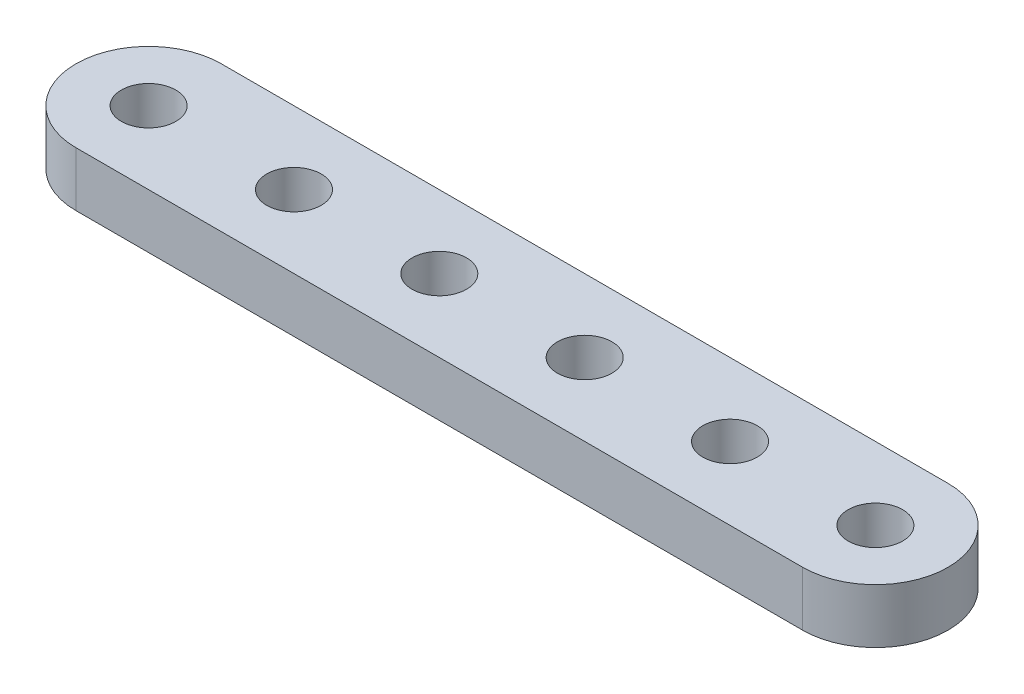
ISO-10303-21;
HEADER;
FILE_DESCRIPTION(('STEP AP214'),'2;1');
FILE_NAME('part.step','',(''),(''),'','','');
FILE_SCHEMA(('AUTOMOTIVE_DESIGN { 1 0 10303 214 1 1 1 1 }'));
ENDSEC;
DATA;
#1=APPLICATION_CONTEXT('core data for automotive mechanical design processes');
#2=APPLICATION_PROTOCOL_DEFINITION('international standard','automotive_design',2000,#1);
#3=PRODUCT_CONTEXT('',#1,'mechanical');
#4=PRODUCT('Part','Part','',(#3));
#5=PRODUCT_RELATED_PRODUCT_CATEGORY('part','',(#4));
#6=PRODUCT_DEFINITION_FORMATION('','',#4);
#7=PRODUCT_DEFINITION_CONTEXT('part definition',#1,'design');
#8=PRODUCT_DEFINITION('design','',#6,#7);
#9=PRODUCT_DEFINITION_SHAPE('','',#8);
#10=(LENGTH_UNIT() NAMED_UNIT(*) SI_UNIT(.MILLI.,.METRE.));
#11=(NAMED_UNIT(*) PLANE_ANGLE_UNIT() SI_UNIT($,.RADIAN.));
#12=(NAMED_UNIT(*) SI_UNIT($,.STERADIAN.) SOLID_ANGLE_UNIT());
#13=UNCERTAINTY_MEASURE_WITH_UNIT(LENGTH_MEASURE(1.E-05),#10,'distance_accuracy_value','');
#14=(GEOMETRIC_REPRESENTATION_CONTEXT(3) GLOBAL_UNCERTAINTY_ASSIGNED_CONTEXT((#13)) GLOBAL_UNIT_ASSIGNED_CONTEXT((#10,
#11,#12)) REPRESENTATION_CONTEXT('',''));
#15=CARTESIAN_POINT('',(0.,0.,0.));
#16=DIRECTION('',(0.,0.,1.));
#17=DIRECTION('',(1.,0.,0.));
#18=AXIS2_PLACEMENT_3D('',#15,#16,#17);
#19=CARTESIAN_POINT('',(0.,3.,0.));
#20=DIRECTION('',(0.,1.,0.));
#21=DIRECTION('',(0.,0.,1.));
#22=AXIS2_PLACEMENT_3D('',#19,#20,#21);
#23=PLANE('',#22);
#24=CARTESIAN_POINT('',(32.,3.,0.));
#25=DIRECTION('',(0.,1.,0.));
#26=DIRECTION('',(0.,0.,1.));
#27=AXIS2_PLACEMENT_3D('',#24,#25,#26);
#28=CIRCLE('',#27,1.5);
#29=CARTESIAN_POINT('',(32.,3.,1.5));
#30=VERTEX_POINT('',#29);
#31=EDGE_CURVE('E135',#30,#30,#28,.T.);
#32=ORIENTED_EDGE('',*,*,#31,.F.);
#33=EDGE_LOOP('',(#32));
#34=FACE_BOUND('',#33,.T.);
#35=CARTESIAN_POINT('',(16.,3.,0.));
#36=DIRECTION('',(0.,1.,0.));
#37=DIRECTION('',(0.,0.,1.));
#38=AXIS2_PLACEMENT_3D('',#35,#36,#37);
#39=CIRCLE('',#38,1.5);
#40=CARTESIAN_POINT('',(16.,3.,1.5));
#41=VERTEX_POINT('',#40);
#42=EDGE_CURVE('E123',#41,#41,#39,.T.);
#43=ORIENTED_EDGE('',*,*,#42,.F.);
#44=EDGE_LOOP('',(#43));
#45=FACE_BOUND('',#44,.T.);
#46=CARTESIAN_POINT('',(0.,3.,0.));
#47=DIRECTION('',(0.,1.,0.));
#48=DIRECTION('',(0.,0.,1.));
#49=AXIS2_PLACEMENT_3D('',#46,#47,#48);
#50=CIRCLE('',#49,1.5);
#51=CARTESIAN_POINT('',(0.,3.,1.5));
#52=VERTEX_POINT('',#51);
#53=EDGE_CURVE('E102',#52,#52,#50,.T.);
#54=ORIENTED_EDGE('',*,*,#53,.F.);
#55=EDGE_LOOP('',(#54));
#56=FACE_BOUND('',#55,.T.);
#57=CARTESIAN_POINT('',(0.,3.,0.));
#58=DIRECTION('',(0.,1.,0.));
#59=DIRECTION('',(0.,0.,1.));
#60=AXIS2_PLACEMENT_3D('',#57,#58,#59);
#61=CIRCLE('',#60,4.);
#62=CARTESIAN_POINT('',(0.,3.,-4.));
#63=VERTEX_POINT('',#62);
#64=CARTESIAN_POINT('',(0.,3.,4.));
#65=VERTEX_POINT('',#64);
#66=EDGE_CURVE('E87',#63,#65,#61,.T.);
#67=ORIENTED_EDGE('',*,*,#66,.T.);
#68=DIRECTION('',(1.,0.,0.));
#69=VECTOR('',#68,1.);
#70=CARTESIAN_POINT('',(0.,3.,4.));
#71=LINE('',#70,#69);
#72=CARTESIAN_POINT('',(40.,3.,4.));
#73=VERTEX_POINT('',#72);
#74=EDGE_CURVE('E82',#65,#73,#71,.T.);
#75=ORIENTED_EDGE('',*,*,#74,.T.);
#76=CARTESIAN_POINT('',(40.,3.,0.));
#77=DIRECTION('',(0.,1.,0.));
#78=DIRECTION('',(0.,0.,1.));
#79=AXIS2_PLACEMENT_3D('',#76,#77,#78);
#80=CIRCLE('',#79,4.);
#81=CARTESIAN_POINT('',(40.,3.,-4.));
#82=VERTEX_POINT('',#81);
#83=EDGE_CURVE('E85',#73,#82,#80,.T.);
#84=ORIENTED_EDGE('',*,*,#83,.T.);
#85=DIRECTION('',(-1.,0.,0.));
#86=VECTOR('',#85,1.);
#87=CARTESIAN_POINT('',(0.,3.,-4.));
#88=LINE('',#87,#86);
#89=EDGE_CURVE('E52',#82,#63,#88,.T.);
#90=ORIENTED_EDGE('',*,*,#89,.T.);
#91=EDGE_LOOP('',(#67,#75,#84,#90));
#92=FACE_BOUND('',#91,.T.);
#93=CARTESIAN_POINT('',(8.,3.,0.));
#94=DIRECTION('',(0.,1.,0.));
#95=DIRECTION('',(0.,0.,1.));
#96=AXIS2_PLACEMENT_3D('',#93,#94,#95);
#97=CIRCLE('',#96,1.5);
#98=CARTESIAN_POINT('',(8.,3.,1.5));
#99=VERTEX_POINT('',#98);
#100=EDGE_CURVE('E117',#99,#99,#97,.T.);
#101=ORIENTED_EDGE('',*,*,#100,.F.);
#102=EDGE_LOOP('',(#101));
#103=FACE_BOUND('',#102,.T.);
#104=CARTESIAN_POINT('',(24.,3.,0.));
#105=DIRECTION('',(0.,1.,0.));
#106=DIRECTION('',(0.,0.,1.));
#107=AXIS2_PLACEMENT_3D('',#104,#105,#106);
#108=CIRCLE('',#107,1.5);
#109=CARTESIAN_POINT('',(24.,3.,1.5));
#110=VERTEX_POINT('',#109);
#111=EDGE_CURVE('E129',#110,#110,#108,.T.);
#112=ORIENTED_EDGE('',*,*,#111,.F.);
#113=EDGE_LOOP('',(#112));
#114=FACE_BOUND('',#113,.T.);
#115=CARTESIAN_POINT('',(40.,3.,0.));
#116=DIRECTION('',(0.,1.,0.));
#117=DIRECTION('',(0.,0.,1.));
#118=AXIS2_PLACEMENT_3D('',#115,#116,#117);
#119=CIRCLE('',#118,1.5);
#120=CARTESIAN_POINT('',(40.,3.,1.5));
#121=VERTEX_POINT('',#120);
#122=EDGE_CURVE('E141',#121,#121,#119,.T.);
#123=ORIENTED_EDGE('',*,*,#122,.F.);
#124=EDGE_LOOP('',(#123));
#125=FACE_BOUND('',#124,.T.);
#126=ADVANCED_FACE('F35',(#34,#45,#56,#92,#103,#114,#125),#23,.T.);
#127=CARTESIAN_POINT('',(0.,0.,0.));
#128=DIRECTION('',(0.,1.,0.));
#129=DIRECTION('',(0.,0.,1.));
#130=AXIS2_PLACEMENT_3D('',#127,#128,#129);
#131=PLANE('',#130);
#132=CARTESIAN_POINT('',(0.,0.,0.));
#133=DIRECTION('',(0.,1.,0.));
#134=DIRECTION('',(0.,0.,1.));
#135=AXIS2_PLACEMENT_3D('',#132,#133,#134);
#136=CIRCLE('',#135,4.);
#137=CARTESIAN_POINT('',(0.,0.,-4.));
#138=VERTEX_POINT('',#137);
#139=CARTESIAN_POINT('',(0.,0.,4.));
#140=VERTEX_POINT('',#139);
#141=EDGE_CURVE('E99',#138,#140,#136,.T.);
#142=ORIENTED_EDGE('',*,*,#141,.F.);
#143=DIRECTION('',(-1.,0.,0.));
#144=VECTOR('',#143,1.);
#145=CARTESIAN_POINT('',(0.,0.,-4.));
#146=LINE('',#145,#144);
#147=CARTESIAN_POINT('',(40.,0.,-4.));
#148=VERTEX_POINT('',#147);
#149=EDGE_CURVE('E75',#148,#138,#146,.T.);
#150=ORIENTED_EDGE('',*,*,#149,.F.);
#151=CARTESIAN_POINT('',(40.,0.,0.));
#152=DIRECTION('',(0.,1.,0.));
#153=DIRECTION('',(0.,0.,1.));
#154=AXIS2_PLACEMENT_3D('',#151,#152,#153);
#155=CIRCLE('',#154,4.);
#156=CARTESIAN_POINT('',(40.,0.,4.));
#157=VERTEX_POINT('',#156);
#158=EDGE_CURVE('E69',#157,#148,#155,.T.);
#159=ORIENTED_EDGE('',*,*,#158,.F.);
#160=DIRECTION('',(1.,0.,0.));
#161=VECTOR('',#160,1.);
#162=CARTESIAN_POINT('',(0.,0.,4.));
#163=LINE('',#162,#161);
#164=EDGE_CURVE('E91',#140,#157,#163,.T.);
#165=ORIENTED_EDGE('',*,*,#164,.F.);
#166=EDGE_LOOP('',(#142,#150,#159,#165));
#167=FACE_BOUND('',#166,.T.);
#168=CARTESIAN_POINT('',(0.,0.,0.));
#169=DIRECTION('',(0.,1.,0.));
#170=DIRECTION('',(0.,0.,1.));
#171=AXIS2_PLACEMENT_3D('',#168,#169,#170);
#172=CIRCLE('',#171,1.5);
#173=CARTESIAN_POINT('',(0.,0.,1.5));
#174=VERTEX_POINT('',#173);
#175=EDGE_CURVE('E114',#174,#174,#172,.T.);
#176=ORIENTED_EDGE('',*,*,#175,.T.);
#177=EDGE_LOOP('',(#176));
#178=FACE_BOUND('',#177,.T.);
#179=CARTESIAN_POINT('',(8.,0.,0.));
#180=DIRECTION('',(0.,1.,0.));
#181=DIRECTION('',(0.,0.,1.));
#182=AXIS2_PLACEMENT_3D('',#179,#180,#181);
#183=CIRCLE('',#182,1.5);
#184=CARTESIAN_POINT('',(8.,0.,1.5));
#185=VERTEX_POINT('',#184);
#186=EDGE_CURVE('E120',#185,#185,#183,.T.);
#187=ORIENTED_EDGE('',*,*,#186,.T.);
#188=EDGE_LOOP('',(#187));
#189=FACE_BOUND('',#188,.T.);
#190=CARTESIAN_POINT('',(16.,0.,0.));
#191=DIRECTION('',(0.,1.,0.));
#192=DIRECTION('',(0.,0.,1.));
#193=AXIS2_PLACEMENT_3D('',#190,#191,#192);
#194=CIRCLE('',#193,1.5);
#195=CARTESIAN_POINT('',(16.,0.,1.5));
#196=VERTEX_POINT('',#195);
#197=EDGE_CURVE('E126',#196,#196,#194,.T.);
#198=ORIENTED_EDGE('',*,*,#197,.T.);
#199=EDGE_LOOP('',(#198));
#200=FACE_BOUND('',#199,.T.);
#201=CARTESIAN_POINT('',(24.,0.,0.));
#202=DIRECTION('',(0.,1.,0.));
#203=DIRECTION('',(0.,0.,1.));
#204=AXIS2_PLACEMENT_3D('',#201,#202,#203);
#205=CIRCLE('',#204,1.5);
#206=CARTESIAN_POINT('',(24.,0.,1.5));
#207=VERTEX_POINT('',#206);
#208=EDGE_CURVE('E132',#207,#207,#205,.T.);
#209=ORIENTED_EDGE('',*,*,#208,.T.);
#210=EDGE_LOOP('',(#209));
#211=FACE_BOUND('',#210,.T.);
#212=CARTESIAN_POINT('',(32.,0.,0.));
#213=DIRECTION('',(0.,1.,0.));
#214=DIRECTION('',(0.,0.,1.));
#215=AXIS2_PLACEMENT_3D('',#212,#213,#214);
#216=CIRCLE('',#215,1.5);
#217=CARTESIAN_POINT('',(32.,0.,1.5));
#218=VERTEX_POINT('',#217);
#219=EDGE_CURVE('E138',#218,#218,#216,.T.);
#220=ORIENTED_EDGE('',*,*,#219,.T.);
#221=EDGE_LOOP('',(#220));
#222=FACE_BOUND('',#221,.T.);
#223=CARTESIAN_POINT('',(40.,0.,0.));
#224=DIRECTION('',(0.,1.,0.));
#225=DIRECTION('',(0.,0.,1.));
#226=AXIS2_PLACEMENT_3D('',#223,#224,#225);
#227=CIRCLE('',#226,1.5);
#228=CARTESIAN_POINT('',(40.,0.,1.5));
#229=VERTEX_POINT('',#228);
#230=EDGE_CURVE('E144',#229,#229,#227,.T.);
#231=ORIENTED_EDGE('',*,*,#230,.T.);
#232=EDGE_LOOP('',(#231));
#233=FACE_BOUND('',#232,.T.);
#234=ADVANCED_FACE('F110',(#167,#178,#189,#200,#211,#222,#233),#131,.F.);
#235=CARTESIAN_POINT('',(0.,3.,0.));
#236=DIRECTION('',(0.,-1.,0.));
#237=DIRECTION('',(0.,0.,-1.));
#238=AXIS2_PLACEMENT_3D('',#235,#236,#237);
#239=CYLINDRICAL_SURFACE('',#238,4.);
#240=ORIENTED_EDGE('',*,*,#141,.T.);
#241=DIRECTION('',(0.,-1.,0.));
#242=VECTOR('',#241,1.);
#243=CARTESIAN_POINT('',(0.,3.,4.));
#244=LINE('',#243,#242);
#245=EDGE_CURVE('E11',#65,#140,#244,.T.);
#246=ORIENTED_EDGE('',*,*,#245,.F.);
#247=ORIENTED_EDGE('',*,*,#66,.F.);
#248=DIRECTION('',(0.,-1.,0.));
#249=VECTOR('',#248,1.);
#250=CARTESIAN_POINT('',(0.,3.,-4.));
#251=LINE('',#250,#249);
#252=EDGE_CURVE('E95',#63,#138,#251,.T.);
#253=ORIENTED_EDGE('',*,*,#252,.T.);
#254=EDGE_LOOP('',(#240,#246,#247,#253));
#255=FACE_BOUND('',#254,.T.);
#256=ADVANCED_FACE('F37',(#255),#239,.T.);
#257=CARTESIAN_POINT('',(0.,3.,4.));
#258=DIRECTION('',(0.,0.,-1.));
#259=DIRECTION('',(-1.,0.,0.));
#260=AXIS2_PLACEMENT_3D('',#257,#258,#259);
#261=PLANE('',#260);
#262=ORIENTED_EDGE('',*,*,#164,.T.);
#263=DIRECTION('',(0.,-1.,0.));
#264=VECTOR('',#263,1.);
#265=CARTESIAN_POINT('',(40.,3.,4.));
#266=LINE('',#265,#264);
#267=EDGE_CURVE('E44',#73,#157,#266,.T.);
#268=ORIENTED_EDGE('',*,*,#267,.F.);
#269=ORIENTED_EDGE('',*,*,#74,.F.);
#270=ORIENTED_EDGE('',*,*,#245,.T.);
#271=EDGE_LOOP('',(#262,#268,#269,#270));
#272=FACE_BOUND('',#271,.T.);
#273=ADVANCED_FACE('F90',(#272),#261,.F.);
#274=CARTESIAN_POINT('',(40.,3.,0.));
#275=DIRECTION('',(0.,-1.,0.));
#276=DIRECTION('',(0.,0.,-1.));
#277=AXIS2_PLACEMENT_3D('',#274,#275,#276);
#278=CYLINDRICAL_SURFACE('',#277,4.);
#279=ORIENTED_EDGE('',*,*,#158,.T.);
#280=DIRECTION('',(0.,-1.,0.));
#281=VECTOR('',#280,1.);
#282=CARTESIAN_POINT('',(40.,3.,-4.));
#283=LINE('',#282,#281);
#284=EDGE_CURVE('E92',#82,#148,#283,.T.);
#285=ORIENTED_EDGE('',*,*,#284,.F.);
#286=ORIENTED_EDGE('',*,*,#83,.F.);
#287=ORIENTED_EDGE('',*,*,#267,.T.);
#288=EDGE_LOOP('',(#279,#285,#286,#287));
#289=FACE_BOUND('',#288,.T.);
#290=ADVANCED_FACE('F93',(#289),#278,.T.);
#291=CARTESIAN_POINT('',(0.,3.,-4.));
#292=DIRECTION('',(0.,0.,1.));
#293=DIRECTION('',(1.,0.,0.));
#294=AXIS2_PLACEMENT_3D('',#291,#292,#293);
#295=PLANE('',#294);
#296=ORIENTED_EDGE('',*,*,#149,.T.);
#297=ORIENTED_EDGE('',*,*,#252,.F.);
#298=ORIENTED_EDGE('',*,*,#89,.F.);
#299=ORIENTED_EDGE('',*,*,#284,.T.);
#300=EDGE_LOOP('',(#296,#297,#298,#299));
#301=FACE_BOUND('',#300,.T.);
#302=ADVANCED_FACE('F107',(#301),#295,.F.);
#303=CARTESIAN_POINT('',(0.,3.,0.));
#304=DIRECTION('',(0.,-1.,0.));
#305=DIRECTION('',(0.,0.,-1.));
#306=AXIS2_PLACEMENT_3D('',#303,#304,#305);
#307=CYLINDRICAL_SURFACE('',#306,1.5);
#308=ORIENTED_EDGE('',*,*,#53,.T.);
#309=EDGE_LOOP('',(#308));
#310=FACE_BOUND('',#309,.T.);
#311=ORIENTED_EDGE('',*,*,#175,.F.);
#312=EDGE_LOOP('',(#311));
#313=FACE_BOUND('',#312,.T.);
#314=ADVANCED_FACE('F163',(#310,#313),#307,.F.);
#315=CARTESIAN_POINT('',(8.,3.,0.));
#316=DIRECTION('',(0.,-1.,0.));
#317=DIRECTION('',(0.,0.,-1.));
#318=AXIS2_PLACEMENT_3D('',#315,#316,#317);
#319=CYLINDRICAL_SURFACE('',#318,1.5);
#320=ORIENTED_EDGE('',*,*,#100,.T.);
#321=EDGE_LOOP('',(#320));
#322=FACE_BOUND('',#321,.T.);
#323=ORIENTED_EDGE('',*,*,#186,.F.);
#324=EDGE_LOOP('',(#323));
#325=FACE_BOUND('',#324,.T.);
#326=ADVANCED_FACE('F209',(#322,#325),#319,.F.);
#327=CARTESIAN_POINT('',(16.,3.,0.));
#328=DIRECTION('',(0.,-1.,0.));
#329=DIRECTION('',(0.,0.,-1.));
#330=AXIS2_PLACEMENT_3D('',#327,#328,#329);
#331=CYLINDRICAL_SURFACE('',#330,1.5);
#332=ORIENTED_EDGE('',*,*,#42,.T.);
#333=EDGE_LOOP('',(#332));
#334=FACE_BOUND('',#333,.T.);
#335=ORIENTED_EDGE('',*,*,#197,.F.);
#336=EDGE_LOOP('',(#335));
#337=FACE_BOUND('',#336,.T.);
#338=ADVANCED_FACE('F217',(#334,#337),#331,.F.);
#339=CARTESIAN_POINT('',(24.,3.,0.));
#340=DIRECTION('',(0.,-1.,0.));
#341=DIRECTION('',(0.,0.,-1.));
#342=AXIS2_PLACEMENT_3D('',#339,#340,#341);
#343=CYLINDRICAL_SURFACE('',#342,1.5);
#344=ORIENTED_EDGE('',*,*,#111,.T.);
#345=EDGE_LOOP('',(#344));
#346=FACE_BOUND('',#345,.T.);
#347=ORIENTED_EDGE('',*,*,#208,.F.);
#348=EDGE_LOOP('',(#347));
#349=FACE_BOUND('',#348,.T.);
#350=ADVANCED_FACE('F225',(#346,#349),#343,.F.);
#351=CARTESIAN_POINT('',(32.,3.,0.));
#352=DIRECTION('',(0.,-1.,0.));
#353=DIRECTION('',(0.,0.,-1.));
#354=AXIS2_PLACEMENT_3D('',#351,#352,#353);
#355=CYLINDRICAL_SURFACE('',#354,1.5);
#356=ORIENTED_EDGE('',*,*,#31,.T.);
#357=EDGE_LOOP('',(#356));
#358=FACE_BOUND('',#357,.T.);
#359=ORIENTED_EDGE('',*,*,#219,.F.);
#360=EDGE_LOOP('',(#359));
#361=FACE_BOUND('',#360,.T.);
#362=ADVANCED_FACE('F234',(#358,#361),#355,.F.);
#363=CARTESIAN_POINT('',(40.,3.,0.));
#364=DIRECTION('',(0.,-1.,0.));
#365=DIRECTION('',(0.,0.,-1.));
#366=AXIS2_PLACEMENT_3D('',#363,#364,#365);
#367=CYLINDRICAL_SURFACE('',#366,1.5);
#368=ORIENTED_EDGE('',*,*,#122,.T.);
#369=EDGE_LOOP('',(#368));
#370=FACE_BOUND('',#369,.T.);
#371=ORIENTED_EDGE('',*,*,#230,.F.);
#372=EDGE_LOOP('',(#371));
#373=FACE_BOUND('',#372,.T.);
#374=ADVANCED_FACE('F150',(#370,#373),#367,.F.);
#375=CLOSED_SHELL('',(#126,#234,#256,#273,#290,#302,#314,#326,#338,#350,#362,#374));
#376=MANIFOLD_SOLID_BREP('B2',#375);
#377=ADVANCED_BREP_SHAPE_REPRESENTATION('',(#18,#376),#14);
#378=SHAPE_DEFINITION_REPRESENTATION(#9,#377);
ENDSEC;
END-ISO-10303-21;
